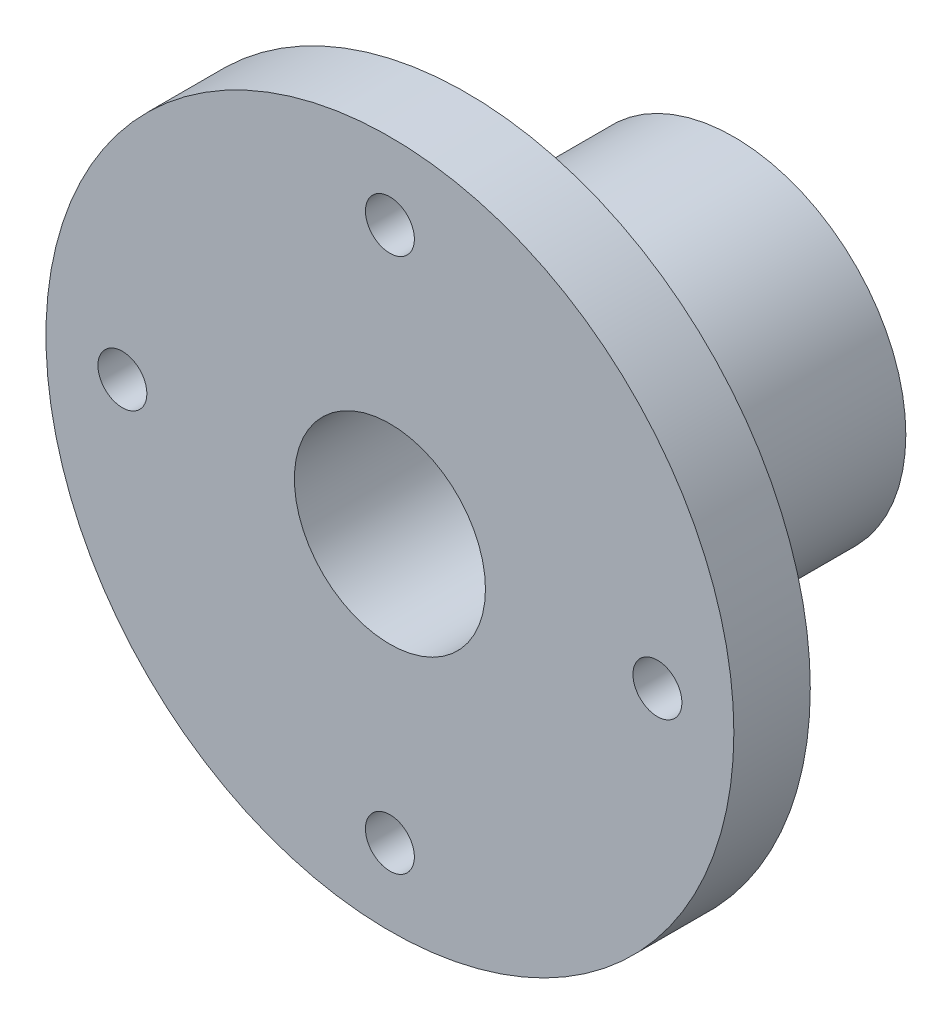
ISO-10303-21;
HEADER;
FILE_DESCRIPTION(('STEP AP214'),'2;1');
FILE_NAME('part.step','',(''),(''),'','','');
FILE_SCHEMA(('AUTOMOTIVE_DESIGN { 1 0 10303 214 1 1 1 1 }'));
ENDSEC;
DATA;
#1=APPLICATION_CONTEXT('core data for automotive mechanical design processes');
#2=APPLICATION_PROTOCOL_DEFINITION('international standard','automotive_design',2000,#1);
#3=PRODUCT_CONTEXT('',#1,'mechanical');
#4=PRODUCT('Part','Part','',(#3));
#5=PRODUCT_RELATED_PRODUCT_CATEGORY('part','',(#4));
#6=PRODUCT_DEFINITION_FORMATION('','',#4);
#7=PRODUCT_DEFINITION_CONTEXT('part definition',#1,'design');
#8=PRODUCT_DEFINITION('design','',#6,#7);
#9=PRODUCT_DEFINITION_SHAPE('','',#8);
#10=(LENGTH_UNIT() NAMED_UNIT(*) SI_UNIT(.MILLI.,.METRE.));
#11=(NAMED_UNIT(*) PLANE_ANGLE_UNIT() SI_UNIT($,.RADIAN.));
#12=(NAMED_UNIT(*) SI_UNIT($,.STERADIAN.) SOLID_ANGLE_UNIT());
#13=UNCERTAINTY_MEASURE_WITH_UNIT(LENGTH_MEASURE(1.E-05),#10,'distance_accuracy_value','');
#14=(GEOMETRIC_REPRESENTATION_CONTEXT(3) GLOBAL_UNCERTAINTY_ASSIGNED_CONTEXT((#13)) GLOBAL_UNIT_ASSIGNED_CONTEXT((#10,
#11,#12)) REPRESENTATION_CONTEXT('',''));
#15=CARTESIAN_POINT('',(0.,0.,0.));
#16=DIRECTION('',(0.,0.,1.));
#17=DIRECTION('',(1.,0.,0.));
#18=AXIS2_PLACEMENT_3D('',#15,#16,#17);
#19=CARTESIAN_POINT('',(0.,0.,-35.));
#20=DIRECTION('',(0.,0.,1.));
#21=DIRECTION('',(1.,0.,0.));
#22=AXIS2_PLACEMENT_3D('',#19,#20,#21);
#23=CYLINDRICAL_SURFACE('',#22,12.5);
#24=CARTESIAN_POINT('',(0.,0.,10.));
#25=DIRECTION('',(0.,0.,1.));
#26=DIRECTION('',(1.,0.,0.));
#27=AXIS2_PLACEMENT_3D('',#24,#25,#26);
#28=CIRCLE('',#27,12.5);
#29=CARTESIAN_POINT('',(12.5,0.,10.));
#30=VERTEX_POINT('',#29);
#31=EDGE_CURVE('E189',#30,#30,#28,.T.);
#32=ORIENTED_EDGE('',*,*,#31,.T.);
#33=EDGE_LOOP('',(#32));
#34=FACE_BOUND('',#33,.T.);
#35=CARTESIAN_POINT('',(0.,0.,-35.));
#36=DIRECTION('',(0.,0.,1.));
#37=DIRECTION('',(1.,0.,0.));
#38=AXIS2_PLACEMENT_3D('',#35,#36,#37);
#39=CIRCLE('',#38,12.5);
#40=CARTESIAN_POINT('',(12.5,0.,-35.));
#41=VERTEX_POINT('',#40);
#42=EDGE_CURVE('E340',#41,#41,#39,.T.);
#43=ORIENTED_EDGE('',*,*,#42,.F.);
#44=EDGE_LOOP('',(#43));
#45=FACE_BOUND('',#44,.T.);
#46=DIRECTION('',(0.,0.,1.));
#47=VECTOR('',#46,1.);
#48=CARTESIAN_POINT('',(4.,11.842719282327,-35.));
#49=LINE('',#48,#47);
#50=CARTESIAN_POINT('',(4.,11.842719282327,-28.));
#51=VERTEX_POINT('',#50);
#52=CARTESIAN_POINT('',(4.,11.842719282327,-6.));
#53=VERTEX_POINT('',#52);
#54=EDGE_CURVE('E203',#51,#53,#49,.T.);
#55=ORIENTED_EDGE('',*,*,#54,.F.);
#56=CARTESIAN_POINT('',(-4.,11.842719282327,-28.));
#57=CARTESIAN_POINT('',(-4.,11.842719282327,-29.0643809044189));
#58=CARTESIAN_POINT('',(-3.56109934168616,12.005579467177,-30.0956155873037));
#59=CARTESIAN_POINT('',(-2.09629276634931,12.3458869062458,-31.5607007525007));
#60=CARTESIAN_POINT('',(-1.05534649825378,12.4996525941874,-31.9989143563186));
#61=CARTESIAN_POINT('',(1.04710072965423,12.5003460459585,-32.0010813941365));
#62=CARTESIAN_POINT('',(2.09036421520958,12.3471977711214,-31.5660875845717));
#63=CARTESIAN_POINT('',(3.56494631593845,12.0047521055576,-30.0923099621094));
#64=CARTESIAN_POINT('',(4.,11.842719282327,-29.0644753189381));
#65=CARTESIAN_POINT('',(4.,11.842719282327,-28.));
#66=B_SPLINE_CURVE_WITH_KNOTS('',3,(#56,#57,#58,#59,#60,#61,#62,#63,#64,#65),.UNSPECIFIED.,.F.,
.F.,(4,2,2,2,4),(0.,0.25,0.5,0.75,1.),.UNSPECIFIED.);
#67=CARTESIAN_POINT('',(-4.,11.842719282327,-28.));
#68=VERTEX_POINT('',#67);
#69=EDGE_CURVE('E119',#68,#51,#66,.T.);
#70=ORIENTED_EDGE('',*,*,#69,.F.);
#71=DIRECTION('',(0.,0.,1.));
#72=VECTOR('',#71,1.);
#73=CARTESIAN_POINT('',(-4.,11.842719282327,-35.));
#74=LINE('',#73,#72);
#75=CARTESIAN_POINT('',(-4.,11.842719282327,-6.));
#76=VERTEX_POINT('',#75);
#77=EDGE_CURVE('E114',#68,#76,#74,.T.);
#78=ORIENTED_EDGE('',*,*,#77,.T.);
#79=CARTESIAN_POINT('',(4.,11.842719282327,-6.));
#80=CARTESIAN_POINT('',(4.,11.842719282327,-4.93561909558115));
#81=CARTESIAN_POINT('',(3.56109934168617,12.005579467177,-3.90438441269636));
#82=CARTESIAN_POINT('',(2.09629276634932,12.3458869062458,-2.43929924749928));
#83=CARTESIAN_POINT('',(1.05534649825378,12.4996525941874,-2.00108564368137));
#84=CARTESIAN_POINT('',(-1.04710072965422,12.5003460459585,-1.99891860586349));
#85=CARTESIAN_POINT('',(-2.09036421520958,12.3471977711214,-2.4339124154283));
#86=CARTESIAN_POINT('',(-3.56494631593845,12.0047521055576,-3.90769003789065));
#87=CARTESIAN_POINT('',(-4.,11.842719282327,-4.93552468106193));
#88=CARTESIAN_POINT('',(-4.,11.842719282327,-6.));
#89=B_SPLINE_CURVE_WITH_KNOTS('',3,(#79,#80,#81,#82,#83,#84,#85,#86,#87,#88),.UNSPECIFIED.,.F.,
.F.,(4,2,2,2,4),(0.,0.25,0.5,0.75,1.),.UNSPECIFIED.);
#90=EDGE_CURVE('E63',#53,#76,#89,.T.);
#91=ORIENTED_EDGE('',*,*,#90,.F.);
#92=EDGE_LOOP('',(#55,#70,#78,#91));
#93=FACE_BOUND('',#92,.T.);
#94=ADVANCED_FACE('F43',(#34,#45,#93),#23,.F.);
#95=CARTESIAN_POINT('',(0.,0.,-35.));
#96=DIRECTION('',(0.,0.,1.));
#97=DIRECTION('',(1.,0.,0.));
#98=AXIS2_PLACEMENT_3D('',#95,#96,#97);
#99=CYLINDRICAL_SURFACE('',#98,22.5);
#100=CARTESIAN_POINT('',(0.,0.,-35.));
#101=DIRECTION('',(0.,0.,1.));
#102=DIRECTION('',(1.,0.,0.));
#103=AXIS2_PLACEMENT_3D('',#100,#101,#102);
#104=CIRCLE('',#103,22.5);
#105=CARTESIAN_POINT('',(22.5,0.,-35.));
#106=VERTEX_POINT('',#105);
#107=EDGE_CURVE('E11',#106,#106,#104,.T.);
#108=ORIENTED_EDGE('',*,*,#107,.T.);
#109=EDGE_LOOP('',(#108));
#110=FACE_BOUND('',#109,.T.);
#111=CARTESIAN_POINT('',(0.,0.,0.));
#112=DIRECTION('',(0.,0.,1.));
#113=DIRECTION('',(1.,0.,0.));
#114=AXIS2_PLACEMENT_3D('',#111,#112,#113);
#115=CIRCLE('',#114,22.5);
#116=CARTESIAN_POINT('',(22.5,0.,0.));
#117=VERTEX_POINT('',#116);
#118=EDGE_CURVE('E55',#117,#117,#115,.T.);
#119=ORIENTED_EDGE('',*,*,#118,.F.);
#120=EDGE_LOOP('',(#119));
#121=FACE_BOUND('',#120,.T.);
#122=ADVANCED_FACE('F45',(#110,#121),#99,.T.);
#123=CARTESIAN_POINT('',(0.,0.,-35.));
#124=DIRECTION('',(0.,0.,1.));
#125=DIRECTION('',(1.,0.,0.));
#126=AXIS2_PLACEMENT_3D('',#123,#124,#125);
#127=PLANE('',#126);
#128=ORIENTED_EDGE('',*,*,#42,.T.);
#129=EDGE_LOOP('',(#128));
#130=FACE_BOUND('',#129,.T.);
#131=ORIENTED_EDGE('',*,*,#107,.F.);
#132=EDGE_LOOP('',(#131));
#133=FACE_BOUND('',#132,.T.);
#134=ADVANCED_FACE('F359',(#130,#133),#127,.F.);
#135=CARTESIAN_POINT('',(0.,0.,10.));
#136=DIRECTION('',(0.,0.,1.));
#137=DIRECTION('',(1.,0.,0.));
#138=AXIS2_PLACEMENT_3D('',#135,#136,#137);
#139=PLANE('',#138);
#140=CARTESIAN_POINT('',(0.,35.,10.));
#141=DIRECTION('',(0.,0.,-1.));
#142=DIRECTION('',(-1.,0.,0.));
#143=AXIS2_PLACEMENT_3D('',#140,#141,#142);
#144=CIRCLE('',#143,3.2);
#145=CARTESIAN_POINT('',(-3.2,35.,10.));
#146=VERTEX_POINT('',#145);
#147=EDGE_CURVE('E291',#146,#146,#144,.T.);
#148=ORIENTED_EDGE('',*,*,#147,.T.);
#149=EDGE_LOOP('',(#148));
#150=FACE_BOUND('',#149,.T.);
#151=CARTESIAN_POINT('',(-35.,-1.2220184685951E-13,10.));
#152=DIRECTION('',(0.,0.,-1.));
#153=DIRECTION('',(-1.,0.,0.));
#154=AXIS2_PLACEMENT_3D('',#151,#152,#153);
#155=CIRCLE('',#154,3.2);
#156=CARTESIAN_POINT('',(-38.2,-1.2220184685951E-13,10.));
#157=VERTEX_POINT('',#156);
#158=EDGE_CURVE('E271',#157,#157,#155,.T.);
#159=ORIENTED_EDGE('',*,*,#158,.T.);
#160=EDGE_LOOP('',(#159));
#161=FACE_BOUND('',#160,.T.);
#162=CARTESIAN_POINT('',(2.44403693719019E-13,-35.,10.));
#163=DIRECTION('',(0.,0.,-1.));
#164=DIRECTION('',(-1.,0.,0.));
#165=AXIS2_PLACEMENT_3D('',#162,#163,#164);
#166=CIRCLE('',#165,3.2);
#167=CARTESIAN_POINT('',(-3.19999999999975,-35.,10.));
#168=VERTEX_POINT('',#167);
#169=EDGE_CURVE('E251',#168,#168,#166,.T.);
#170=ORIENTED_EDGE('',*,*,#169,.T.);
#171=EDGE_LOOP('',(#170));
#172=FACE_BOUND('',#171,.T.);
#173=CARTESIAN_POINT('',(35.,3.66605540578529E-13,10.));
#174=DIRECTION('',(0.,0.,-1.));
#175=DIRECTION('',(-1.,0.,0.));
#176=AXIS2_PLACEMENT_3D('',#173,#174,#175);
#177=CIRCLE('',#176,3.2);
#178=CARTESIAN_POINT('',(31.8,3.66605540578529E-13,10.));
#179=VERTEX_POINT('',#178);
#180=EDGE_CURVE('E130',#179,#179,#177,.T.);
#181=ORIENTED_EDGE('',*,*,#180,.T.);
#182=EDGE_LOOP('',(#181));
#183=FACE_BOUND('',#182,.T.);
#184=CARTESIAN_POINT('',(0.,0.,10.));
#185=DIRECTION('',(0.,0.,1.));
#186=DIRECTION('',(1.,0.,0.));
#187=AXIS2_PLACEMENT_3D('',#184,#185,#186);
#188=CIRCLE('',#187,45.);
#189=CARTESIAN_POINT('',(45.,0.,10.));
#190=VERTEX_POINT('',#189);
#191=EDGE_CURVE('E335',#190,#190,#188,.T.);
#192=ORIENTED_EDGE('',*,*,#191,.T.);
#193=EDGE_LOOP('',(#192));
#194=FACE_BOUND('',#193,.T.);
#195=ORIENTED_EDGE('',*,*,#31,.F.);
#196=EDGE_LOOP('',(#195));
#197=FACE_BOUND('',#196,.T.);
#198=ADVANCED_FACE('F319',(#150,#161,#172,#183,#194,#197),#139,.T.);
#199=CARTESIAN_POINT('',(0.,0.,0.));
#200=DIRECTION('',(0.,0.,1.));
#201=DIRECTION('',(1.,0.,0.));
#202=AXIS2_PLACEMENT_3D('',#199,#200,#201);
#203=PLANE('',#202);
#204=CARTESIAN_POINT('',(0.,35.,0.));
#205=DIRECTION('',(0.,0.,-1.));
#206=DIRECTION('',(-1.,0.,0.));
#207=AXIS2_PLACEMENT_3D('',#204,#205,#206);
#208=CIRCLE('',#207,7.3);
#209=CARTESIAN_POINT('',(-7.3,35.,0.));
#210=VERTEX_POINT('',#209);
#211=EDGE_CURVE('E307',#210,#210,#208,.T.);
#212=ORIENTED_EDGE('',*,*,#211,.F.);
#213=EDGE_LOOP('',(#212));
#214=FACE_BOUND('',#213,.T.);
#215=CARTESIAN_POINT('',(-35.,-1.2220184685951E-13,0.));
#216=DIRECTION('',(0.,0.,-1.));
#217=DIRECTION('',(-1.,0.,0.));
#218=AXIS2_PLACEMENT_3D('',#215,#216,#217);
#219=CIRCLE('',#218,7.3);
#220=CARTESIAN_POINT('',(-42.3,-1.2220184685951E-13,0.));
#221=VERTEX_POINT('',#220);
#222=EDGE_CURVE('E287',#221,#221,#219,.T.);
#223=ORIENTED_EDGE('',*,*,#222,.F.);
#224=EDGE_LOOP('',(#223));
#225=FACE_BOUND('',#224,.T.);
#226=CARTESIAN_POINT('',(2.44403693719019E-13,-35.,0.));
#227=DIRECTION('',(0.,0.,-1.));
#228=DIRECTION('',(-1.,0.,0.));
#229=AXIS2_PLACEMENT_3D('',#226,#227,#228);
#230=CIRCLE('',#229,7.3);
#231=CARTESIAN_POINT('',(-7.29999999999976,-35.,0.));
#232=VERTEX_POINT('',#231);
#233=EDGE_CURVE('E267',#232,#232,#230,.T.);
#234=ORIENTED_EDGE('',*,*,#233,.F.);
#235=EDGE_LOOP('',(#234));
#236=FACE_BOUND('',#235,.T.);
#237=CARTESIAN_POINT('',(35.,3.66605540578529E-13,0.));
#238=DIRECTION('',(0.,0.,-1.));
#239=DIRECTION('',(-1.,0.,0.));
#240=AXIS2_PLACEMENT_3D('',#237,#238,#239);
#241=CIRCLE('',#240,7.3);
#242=CARTESIAN_POINT('',(27.7,3.66605540578529E-13,0.));
#243=VERTEX_POINT('',#242);
#244=EDGE_CURVE('E247',#243,#243,#241,.T.);
#245=ORIENTED_EDGE('',*,*,#244,.F.);
#246=EDGE_LOOP('',(#245));
#247=FACE_BOUND('',#246,.T.);
#248=ORIENTED_EDGE('',*,*,#118,.T.);
#249=EDGE_LOOP('',(#248));
#250=FACE_BOUND('',#249,.T.);
#251=CARTESIAN_POINT('',(0.,0.,0.));
#252=DIRECTION('',(0.,0.,1.));
#253=DIRECTION('',(1.,0.,0.));
#254=AXIS2_PLACEMENT_3D('',#251,#252,#253);
#255=CIRCLE('',#254,45.);
#256=CARTESIAN_POINT('',(45.,0.,0.));
#257=VERTEX_POINT('',#256);
#258=EDGE_CURVE('E332',#257,#257,#255,.T.);
#259=ORIENTED_EDGE('',*,*,#258,.F.);
#260=EDGE_LOOP('',(#259));
#261=FACE_BOUND('',#260,.T.);
#262=ADVANCED_FACE('F315',(#214,#225,#236,#247,#250,#261),#203,.F.);
#263=CARTESIAN_POINT('',(0.,0.,10.));
#264=DIRECTION('',(0.,0.,-1.));
#265=DIRECTION('',(-1.,0.,0.));
#266=AXIS2_PLACEMENT_3D('',#263,#264,#265);
#267=CYLINDRICAL_SURFACE('',#266,45.);
#268=ORIENTED_EDGE('',*,*,#191,.F.);
#269=EDGE_LOOP('',(#268));
#270=FACE_BOUND('',#269,.T.);
#271=ORIENTED_EDGE('',*,*,#258,.T.);
#272=EDGE_LOOP('',(#271));
#273=FACE_BOUND('',#272,.T.);
#274=ADVANCED_FACE('F318',(#270,#273),#267,.T.);
#275=CARTESIAN_POINT('',(0.,4.,-35.));
#276=DIRECTION('',(0.,0.,1.));
#277=DIRECTION('',(1.,0.,0.));
#278=AXIS2_PLACEMENT_3D('',#275,#276,#277);
#279=CYLINDRICAL_SURFACE('',#278,12.5);
#280=DIRECTION('',(0.,0.,1.));
#281=VECTOR('',#280,1.);
#282=CARTESIAN_POINT('',(4.,15.842719282327,-35.));
#283=LINE('',#282,#281);
#284=CARTESIAN_POINT('',(4.,15.842719282327,-28.));
#285=VERTEX_POINT('',#284);
#286=CARTESIAN_POINT('',(4.,15.842719282327,-6.));
#287=VERTEX_POINT('',#286);
#288=EDGE_CURVE('E101',#285,#287,#283,.T.);
#289=ORIENTED_EDGE('',*,*,#288,.T.);
#290=CARTESIAN_POINT('',(-4.,15.842719282327,-6.));
#291=CARTESIAN_POINT('',(-4.,15.842719282327,-4.93552468106193));
#292=CARTESIAN_POINT('',(-3.56494631593845,16.0047521055576,-3.90769003789065));
#293=CARTESIAN_POINT('',(-2.09036421520958,16.3471977711214,-2.4339124154283));
#294=CARTESIAN_POINT('',(-1.04710072965422,16.5003460459585,-1.99891860586349));
#295=CARTESIAN_POINT('',(1.05534649825378,16.4996525941874,-2.00108564368137));
#296=CARTESIAN_POINT('',(2.09629276634932,16.3458869062457,-2.43929924749928));
#297=CARTESIAN_POINT('',(3.56109934168617,16.005579467177,-3.90438441269636));
#298=CARTESIAN_POINT('',(4.,15.842719282327,-4.93561909558115));
#299=CARTESIAN_POINT('',(4.,15.842719282327,-6.));
#300=B_SPLINE_CURVE_WITH_KNOTS('',3,(#290,#291,#292,#293,#294,#295,#296,#297,#298,#299),
.UNSPECIFIED.,.F.,.F.,(4,2,2,2,4),(0.,0.25,0.5,0.75,1.),.UNSPECIFIED.);
#301=CARTESIAN_POINT('',(-4.,15.842719282327,-6.));
#302=VERTEX_POINT('',#301);
#303=EDGE_CURVE('E98',#287,#302,#300,.F.);
#304=ORIENTED_EDGE('',*,*,#303,.T.);
#305=DIRECTION('',(0.,0.,1.));
#306=VECTOR('',#305,1.);
#307=CARTESIAN_POINT('',(-4.,15.842719282327,-35.));
#308=LINE('',#307,#306);
#309=CARTESIAN_POINT('',(-4.,15.842719282327,-28.));
#310=VERTEX_POINT('',#309);
#311=EDGE_CURVE('E94',#310,#302,#308,.T.);
#312=ORIENTED_EDGE('',*,*,#311,.F.);
#313=CARTESIAN_POINT('',(4.,15.842719282327,-28.));
#314=CARTESIAN_POINT('',(4.,15.842719282327,-29.0644753189381));
#315=CARTESIAN_POINT('',(3.56494631593845,16.0047521055576,-30.0923099621094));
#316=CARTESIAN_POINT('',(2.09036421520958,16.3471977711214,-31.5660875845717));
#317=CARTESIAN_POINT('',(1.04710072965423,16.5003460459585,-32.0010813941365));
#318=CARTESIAN_POINT('',(-1.05534649825378,16.4996525941874,-31.9989143563186));
#319=CARTESIAN_POINT('',(-2.09629276634931,16.3458869062458,-31.5607007525007));
#320=CARTESIAN_POINT('',(-3.56109934168616,16.005579467177,-30.0956155873037));
#321=CARTESIAN_POINT('',(-4.,15.842719282327,-29.0643809044189));
#322=CARTESIAN_POINT('',(-4.,15.842719282327,-28.));
#323=B_SPLINE_CURVE_WITH_KNOTS('',3,(#313,#314,#315,#316,#317,#318,#319,#320,#321,#322),
.UNSPECIFIED.,.F.,.F.,(4,2,2,2,4),(0.,0.25,0.5,0.75,1.),.UNSPECIFIED.);
#324=EDGE_CURVE('E90',#310,#285,#323,.F.);
#325=ORIENTED_EDGE('',*,*,#324,.T.);
#326=EDGE_LOOP('',(#289,#304,#312,#325));
#327=FACE_BOUND('',#326,.T.);
#328=ADVANCED_FACE('F100',(#327),#279,.F.);
#329=CARTESIAN_POINT('',(4.,11.842719282327,-35.));
#330=DIRECTION('',(-1.,0.,0.));
#331=DIRECTION('',(0.,0.,1.));
#332=AXIS2_PLACEMENT_3D('',#329,#330,#331);
#333=PLANE('',#332);
#334=ORIENTED_EDGE('',*,*,#288,.F.);
#335=DIRECTION('',(0.,1.,0.));
#336=VECTOR('',#335,1.);
#337=CARTESIAN_POINT('',(4.,11.842719282327,-28.));
#338=LINE('',#337,#336);
#339=EDGE_CURVE('E73',#51,#285,#338,.T.);
#340=ORIENTED_EDGE('',*,*,#339,.F.);
#341=ORIENTED_EDGE('',*,*,#54,.T.);
#342=DIRECTION('',(0.,1.,0.));
#343=VECTOR('',#342,1.);
#344=CARTESIAN_POINT('',(4.,11.842719282327,-6.));
#345=LINE('',#344,#343);
#346=EDGE_CURVE('E206',#53,#287,#345,.T.);
#347=ORIENTED_EDGE('',*,*,#346,.T.);
#348=EDGE_LOOP('',(#334,#340,#341,#347));
#349=FACE_BOUND('',#348,.T.);
#350=ADVANCED_FACE('F168',(#349),#333,.T.);
#351=CARTESIAN_POINT('',(-4.,11.842719282327,-28.));
#352=CARTESIAN_POINT('',(-4.,11.842719282327,-29.0643809044189));
#353=CARTESIAN_POINT('',(-3.56109934168616,12.005579467177,-30.0956155873037));
#354=CARTESIAN_POINT('',(-2.09629276634931,12.3458869062458,-31.5607007525007));
#355=CARTESIAN_POINT('',(-1.05534649825378,12.4996525941874,-31.9989143563186));
#356=CARTESIAN_POINT('',(1.04710072965423,12.5003460459585,-32.0010813941365));
#357=CARTESIAN_POINT('',(2.09036421520958,12.3471977711214,-31.5660875845717));
#358=CARTESIAN_POINT('',(3.56494631593845,12.0047521055576,-30.0923099621094));
#359=CARTESIAN_POINT('',(4.,11.842719282327,-29.0644753189381));
#360=CARTESIAN_POINT('',(4.,11.842719282327,-28.));
#361=B_SPLINE_CURVE_WITH_KNOTS('',3,(#351,#352,#353,#354,#355,#356,#357,#358,#359,#360),
.UNSPECIFIED.,.F.,.F.,(4,2,2,2,4),(0.,0.25,0.5,0.75,1.),.UNSPECIFIED.);
#362=DIRECTION('',(0.,1.,0.));
#363=VECTOR('',#362,1.);
#364=SURFACE_OF_LINEAR_EXTRUSION('',#361,#363);
#365=ORIENTED_EDGE('',*,*,#324,.F.);
#366=DIRECTION('',(0.,1.,0.));
#367=VECTOR('',#366,1.);
#368=CARTESIAN_POINT('',(-4.,11.842719282327,-28.));
#369=LINE('',#368,#367);
#370=EDGE_CURVE('E117',#68,#310,#369,.T.);
#371=ORIENTED_EDGE('',*,*,#370,.F.);
#372=ORIENTED_EDGE('',*,*,#69,.T.);
#373=ORIENTED_EDGE('',*,*,#339,.T.);
#374=EDGE_LOOP('',(#365,#371,#372,#373));
#375=FACE_BOUND('',#374,.T.);
#376=ADVANCED_FACE('F144',(#375),#364,.T.);
#377=CARTESIAN_POINT('',(4.,11.842719282327,-6.));
#378=CARTESIAN_POINT('',(4.,11.842719282327,-4.93561909558115));
#379=CARTESIAN_POINT('',(3.56109934168617,12.005579467177,-3.90438441269636));
#380=CARTESIAN_POINT('',(2.09629276634932,12.3458869062458,-2.43929924749928));
#381=CARTESIAN_POINT('',(1.05534649825378,12.4996525941874,-2.00108564368137));
#382=CARTESIAN_POINT('',(-1.04710072965422,12.5003460459585,-1.99891860586349));
#383=CARTESIAN_POINT('',(-2.09036421520958,12.3471977711214,-2.4339124154283));
#384=CARTESIAN_POINT('',(-3.56494631593845,12.0047521055576,-3.90769003789065));
#385=CARTESIAN_POINT('',(-4.,11.842719282327,-4.93552468106193));
#386=CARTESIAN_POINT('',(-4.,11.842719282327,-6.));
#387=B_SPLINE_CURVE_WITH_KNOTS('',3,(#377,#378,#379,#380,#381,#382,#383,#384,#385,#386),
.UNSPECIFIED.,.F.,.F.,(4,2,2,2,4),(0.,0.25,0.5,0.75,1.),.UNSPECIFIED.);
#388=DIRECTION('',(0.,1.,0.));
#389=VECTOR('',#388,1.);
#390=SURFACE_OF_LINEAR_EXTRUSION('',#387,#389);
#391=ORIENTED_EDGE('',*,*,#303,.F.);
#392=ORIENTED_EDGE('',*,*,#346,.F.);
#393=ORIENTED_EDGE('',*,*,#90,.T.);
#394=DIRECTION('',(0.,1.,0.));
#395=VECTOR('',#394,1.);
#396=CARTESIAN_POINT('',(-4.,11.842719282327,-6.));
#397=LINE('',#396,#395);
#398=EDGE_CURVE('E105',#76,#302,#397,.T.);
#399=ORIENTED_EDGE('',*,*,#398,.T.);
#400=EDGE_LOOP('',(#391,#392,#393,#399));
#401=FACE_BOUND('',#400,.T.);
#402=ADVANCED_FACE('F109',(#401),#390,.T.);
#403=CARTESIAN_POINT('',(-4.,11.842719282327,-35.));
#404=DIRECTION('',(-1.,0.,0.));
#405=DIRECTION('',(0.,0.,1.));
#406=AXIS2_PLACEMENT_3D('',#403,#404,#405);
#407=PLANE('',#406);
#408=ORIENTED_EDGE('',*,*,#311,.T.);
#409=ORIENTED_EDGE('',*,*,#398,.F.);
#410=ORIENTED_EDGE('',*,*,#77,.F.);
#411=ORIENTED_EDGE('',*,*,#370,.T.);
#412=EDGE_LOOP('',(#408,#409,#410,#411));
#413=FACE_BOUND('',#412,.T.);
#414=ADVANCED_FACE('F116',(#413),#407,.F.);
#415=CARTESIAN_POINT('',(35.,3.66605540578529E-13,0.));
#416=DIRECTION('',(0.,0.,-1.));
#417=DIRECTION('',(-1.,0.,0.));
#418=AXIS2_PLACEMENT_3D('',#415,#416,#417);
#419=CYLINDRICAL_SURFACE('',#418,3.2);
#420=ORIENTED_EDGE('',*,*,#180,.F.);
#421=EDGE_LOOP('',(#420));
#422=FACE_BOUND('',#421,.T.);
#423=CARTESIAN_POINT('',(35.,3.66605540578529E-13,4.38));
#424=DIRECTION('',(0.,0.,-1.));
#425=DIRECTION('',(-1.,0.,0.));
#426=AXIS2_PLACEMENT_3D('',#423,#424,#425);
#427=CIRCLE('',#426,3.2);
#428=CARTESIAN_POINT('',(31.8,3.66605540578529E-13,4.38));
#429=VERTEX_POINT('',#428);
#430=EDGE_CURVE('E237',#429,#429,#427,.T.);
#431=ORIENTED_EDGE('',*,*,#430,.T.);
#432=EDGE_LOOP('',(#431));
#433=FACE_BOUND('',#432,.T.);
#434=ADVANCED_FACE('F395',(#422,#433),#419,.F.);
#435=CARTESIAN_POINT('',(42.275,3.66605540578529E-13,4.38));
#436=DIRECTION('',(0.,0.,1.));
#437=DIRECTION('',(1.,0.,0.));
#438=AXIS2_PLACEMENT_3D('',#435,#436,#437);
#439=PLANE('',#438);
#440=ORIENTED_EDGE('',*,*,#430,.F.);
#441=EDGE_LOOP('',(#440));
#442=FACE_BOUND('',#441,.T.);
#443=CARTESIAN_POINT('',(35.,3.66605540578529E-13,4.38));
#444=DIRECTION('',(0.,0.,-1.));
#445=DIRECTION('',(-1.,0.,0.));
#446=AXIS2_PLACEMENT_3D('',#443,#444,#445);
#447=CIRCLE('',#446,7.275);
#448=CARTESIAN_POINT('',(27.725,3.66605540578529E-13,4.38));
#449=VERTEX_POINT('',#448);
#450=EDGE_CURVE('E240',#449,#449,#447,.T.);
#451=ORIENTED_EDGE('',*,*,#450,.T.);
#452=EDGE_LOOP('',(#451));
#453=FACE_BOUND('',#452,.T.);
#454=ADVANCED_FACE('F448',(#442,#453),#439,.F.);
#455=CARTESIAN_POINT('',(35.,3.66605540578529E-13,0.));
#456=DIRECTION('',(0.,0.,-1.));
#457=DIRECTION('',(-1.,0.,0.));
#458=AXIS2_PLACEMENT_3D('',#455,#456,#457);
#459=CYLINDRICAL_SURFACE('',#458,7.275);
#460=ORIENTED_EDGE('',*,*,#450,.F.);
#461=EDGE_LOOP('',(#460));
#462=FACE_BOUND('',#461,.T.);
#463=CARTESIAN_POINT('',(35.,3.66605540578529E-13,0.0250000000000012));
#464=DIRECTION('',(0.,0.,-1.));
#465=DIRECTION('',(-1.,0.,0.));
#466=AXIS2_PLACEMENT_3D('',#463,#464,#465);
#467=CIRCLE('',#466,7.275);
#468=CARTESIAN_POINT('',(27.725,3.66605540578529E-13,0.0250000000000012));
#469=VERTEX_POINT('',#468);
#470=EDGE_CURVE('E243',#469,#469,#467,.T.);
#471=ORIENTED_EDGE('',*,*,#470,.T.);
#472=EDGE_LOOP('',(#471));
#473=FACE_BOUND('',#472,.T.);
#474=ADVANCED_FACE('F458',(#462,#473),#459,.F.);
#475=CARTESIAN_POINT('',(35.,3.66605540578529E-13,0.));
#476=DIRECTION('',(0.,0.,-1.));
#477=DIRECTION('',(-1.,0.,0.));
#478=AXIS2_PLACEMENT_3D('',#475,#476,#477);
#479=CONICAL_SURFACE('',#478,7.3,0.785398163397507);
#480=ORIENTED_EDGE('',*,*,#470,.F.);
#481=EDGE_LOOP('',(#480));
#482=FACE_BOUND('',#481,.T.);
#483=ORIENTED_EDGE('',*,*,#244,.T.);
#484=EDGE_LOOP('',(#483));
#485=FACE_BOUND('',#484,.T.);
#486=ADVANCED_FACE('F469',(#482,#485),#479,.F.);
#487=CARTESIAN_POINT('',(2.44403693719019E-13,-35.,0.));
#488=DIRECTION('',(0.,0.,-1.));
#489=DIRECTION('',(-1.,0.,0.));
#490=AXIS2_PLACEMENT_3D('',#487,#488,#489);
#491=CYLINDRICAL_SURFACE('',#490,3.2);
#492=ORIENTED_EDGE('',*,*,#169,.F.);
#493=EDGE_LOOP('',(#492));
#494=FACE_BOUND('',#493,.T.);
#495=CARTESIAN_POINT('',(2.44403693719019E-13,-35.,4.38));
#496=DIRECTION('',(0.,0.,-1.));
#497=DIRECTION('',(-1.,0.,0.));
#498=AXIS2_PLACEMENT_3D('',#495,#496,#497);
#499=CIRCLE('',#498,3.2);
#500=CARTESIAN_POINT('',(-3.19999999999976,-35.,4.38));
#501=VERTEX_POINT('',#500);
#502=EDGE_CURVE('E255',#501,#501,#499,.T.);
#503=ORIENTED_EDGE('',*,*,#502,.T.);
#504=EDGE_LOOP('',(#503));
#505=FACE_BOUND('',#504,.T.);
#506=ADVANCED_FACE('F480',(#494,#505),#491,.F.);
#507=CARTESIAN_POINT('',(7.27500000000024,-35.,4.38));
#508=DIRECTION('',(0.,0.,1.));
#509=DIRECTION('',(1.,0.,0.));
#510=AXIS2_PLACEMENT_3D('',#507,#508,#509);
#511=PLANE('',#510);
#512=ORIENTED_EDGE('',*,*,#502,.F.);
#513=EDGE_LOOP('',(#512));
#514=FACE_BOUND('',#513,.T.);
#515=CARTESIAN_POINT('',(2.44403693719019E-13,-35.,4.38));
#516=DIRECTION('',(0.,0.,-1.));
#517=DIRECTION('',(-1.,0.,0.));
#518=AXIS2_PLACEMENT_3D('',#515,#516,#517);
#519=CIRCLE('',#518,7.275);
#520=CARTESIAN_POINT('',(-7.27499999999976,-35.,4.38));
#521=VERTEX_POINT('',#520);
#522=EDGE_CURVE('E259',#521,#521,#519,.T.);
#523=ORIENTED_EDGE('',*,*,#522,.T.);
#524=EDGE_LOOP('',(#523));
#525=FACE_BOUND('',#524,.T.);
#526=ADVANCED_FACE('F491',(#514,#525),#511,.F.);
#527=CARTESIAN_POINT('',(2.44403693719019E-13,-35.,0.));
#528=DIRECTION('',(0.,0.,-1.));
#529=DIRECTION('',(-1.,0.,0.));
#530=AXIS2_PLACEMENT_3D('',#527,#528,#529);
#531=CYLINDRICAL_SURFACE('',#530,7.275);
#532=ORIENTED_EDGE('',*,*,#522,.F.);
#533=EDGE_LOOP('',(#532));
#534=FACE_BOUND('',#533,.T.);
#535=CARTESIAN_POINT('',(2.44403693719019E-13,-35.,0.0250000000000012));
#536=DIRECTION('',(0.,0.,-1.));
#537=DIRECTION('',(-1.,0.,0.));
#538=AXIS2_PLACEMENT_3D('',#535,#536,#537);
#539=CIRCLE('',#538,7.275);
#540=CARTESIAN_POINT('',(-7.27499999999975,-35.,0.0250000000000012));
#541=VERTEX_POINT('',#540);
#542=EDGE_CURVE('E263',#541,#541,#539,.T.);
#543=ORIENTED_EDGE('',*,*,#542,.T.);
#544=EDGE_LOOP('',(#543));
#545=FACE_BOUND('',#544,.T.);
#546=ADVANCED_FACE('F502',(#534,#545),#531,.F.);
#547=CARTESIAN_POINT('',(2.44403693719019E-13,-35.,0.));
#548=DIRECTION('',(0.,0.,-1.));
#549=DIRECTION('',(-1.,0.,0.));
#550=AXIS2_PLACEMENT_3D('',#547,#548,#549);
#551=CONICAL_SURFACE('',#550,7.3,0.785398163397455);
#552=ORIENTED_EDGE('',*,*,#542,.F.);
#553=EDGE_LOOP('',(#552));
#554=FACE_BOUND('',#553,.T.);
#555=ORIENTED_EDGE('',*,*,#233,.T.);
#556=EDGE_LOOP('',(#555));
#557=FACE_BOUND('',#556,.T.);
#558=ADVANCED_FACE('F513',(#554,#557),#551,.F.);
#559=CARTESIAN_POINT('',(-35.,-1.2220184685951E-13,0.));
#560=DIRECTION('',(0.,0.,-1.));
#561=DIRECTION('',(-1.,0.,0.));
#562=AXIS2_PLACEMENT_3D('',#559,#560,#561);
#563=CYLINDRICAL_SURFACE('',#562,3.2);
#564=ORIENTED_EDGE('',*,*,#158,.F.);
#565=EDGE_LOOP('',(#564));
#566=FACE_BOUND('',#565,.T.);
#567=CARTESIAN_POINT('',(-35.,-1.2220184685951E-13,4.38));
#568=DIRECTION('',(0.,0.,-1.));
#569=DIRECTION('',(-1.,0.,0.));
#570=AXIS2_PLACEMENT_3D('',#567,#568,#569);
#571=CIRCLE('',#570,3.2);
#572=CARTESIAN_POINT('',(-38.2,-1.2220184685951E-13,4.38));
#573=VERTEX_POINT('',#572);
#574=EDGE_CURVE('E275',#573,#573,#571,.T.);
#575=ORIENTED_EDGE('',*,*,#574,.T.);
#576=EDGE_LOOP('',(#575));
#577=FACE_BOUND('',#576,.T.);
#578=ADVANCED_FACE('F524',(#566,#577),#563,.F.);
#579=CARTESIAN_POINT('',(-27.725,-1.2220184685951E-13,4.38));
#580=DIRECTION('',(0.,0.,1.));
#581=DIRECTION('',(1.,0.,0.));
#582=AXIS2_PLACEMENT_3D('',#579,#580,#581);
#583=PLANE('',#582);
#584=ORIENTED_EDGE('',*,*,#574,.F.);
#585=EDGE_LOOP('',(#584));
#586=FACE_BOUND('',#585,.T.);
#587=CARTESIAN_POINT('',(-35.,-1.2220184685951E-13,4.38));
#588=DIRECTION('',(0.,0.,-1.));
#589=DIRECTION('',(-1.,0.,0.));
#590=AXIS2_PLACEMENT_3D('',#587,#588,#589);
#591=CIRCLE('',#590,7.275);
#592=CARTESIAN_POINT('',(-42.275,-1.2220184685951E-13,4.38));
#593=VERTEX_POINT('',#592);
#594=EDGE_CURVE('E279',#593,#593,#591,.T.);
#595=ORIENTED_EDGE('',*,*,#594,.T.);
#596=EDGE_LOOP('',(#595));
#597=FACE_BOUND('',#596,.T.);
#598=ADVANCED_FACE('F535',(#586,#597),#583,.F.);
#599=CARTESIAN_POINT('',(-35.,-1.2220184685951E-13,0.));
#600=DIRECTION('',(0.,0.,-1.));
#601=DIRECTION('',(-1.,0.,0.));
#602=AXIS2_PLACEMENT_3D('',#599,#600,#601);
#603=CYLINDRICAL_SURFACE('',#602,7.275);
#604=ORIENTED_EDGE('',*,*,#594,.F.);
#605=EDGE_LOOP('',(#604));
#606=FACE_BOUND('',#605,.T.);
#607=CARTESIAN_POINT('',(-35.,-1.2220184685951E-13,0.0250000000000012));
#608=DIRECTION('',(0.,0.,-1.));
#609=DIRECTION('',(-1.,0.,0.));
#610=AXIS2_PLACEMENT_3D('',#607,#608,#609);
#611=CIRCLE('',#610,7.275);
#612=CARTESIAN_POINT('',(-42.275,-1.2220184685951E-13,0.0250000000000012));
#613=VERTEX_POINT('',#612);
#614=EDGE_CURVE('E283',#613,#613,#611,.T.);
#615=ORIENTED_EDGE('',*,*,#614,.T.);
#616=EDGE_LOOP('',(#615));
#617=FACE_BOUND('',#616,.T.);
#618=ADVANCED_FACE('F546',(#606,#617),#603,.F.);
#619=CARTESIAN_POINT('',(-35.,-1.2220184685951E-13,0.));
#620=DIRECTION('',(0.,0.,-1.));
#621=DIRECTION('',(-1.,0.,0.));
#622=AXIS2_PLACEMENT_3D('',#619,#620,#621);
#623=CONICAL_SURFACE('',#622,7.3,0.785398163397507);
#624=ORIENTED_EDGE('',*,*,#614,.F.);
#625=EDGE_LOOP('',(#624));
#626=FACE_BOUND('',#625,.T.);
#627=ORIENTED_EDGE('',*,*,#222,.T.);
#628=EDGE_LOOP('',(#627));
#629=FACE_BOUND('',#628,.T.);
#630=ADVANCED_FACE('F557',(#626,#629),#623,.F.);
#631=CARTESIAN_POINT('',(0.,35.,0.));
#632=DIRECTION('',(0.,0.,-1.));
#633=DIRECTION('',(-1.,0.,0.));
#634=AXIS2_PLACEMENT_3D('',#631,#632,#633);
#635=CYLINDRICAL_SURFACE('',#634,3.2);
#636=ORIENTED_EDGE('',*,*,#147,.F.);
#637=EDGE_LOOP('',(#636));
#638=FACE_BOUND('',#637,.T.);
#639=CARTESIAN_POINT('',(0.,35.,4.38));
#640=DIRECTION('',(0.,0.,-1.));
#641=DIRECTION('',(-1.,0.,0.));
#642=AXIS2_PLACEMENT_3D('',#639,#640,#641);
#643=CIRCLE('',#642,3.2);
#644=CARTESIAN_POINT('',(-3.2,35.,4.38));
#645=VERTEX_POINT('',#644);
#646=EDGE_CURVE('E295',#645,#645,#643,.T.);
#647=ORIENTED_EDGE('',*,*,#646,.T.);
#648=EDGE_LOOP('',(#647));
#649=FACE_BOUND('',#648,.T.);
#650=ADVANCED_FACE('F568',(#638,#649),#635,.F.);
#651=CARTESIAN_POINT('',(7.275,35.,4.38));
#652=DIRECTION('',(0.,0.,1.));
#653=DIRECTION('',(1.,0.,0.));
#654=AXIS2_PLACEMENT_3D('',#651,#652,#653);
#655=PLANE('',#654);
#656=ORIENTED_EDGE('',*,*,#646,.F.);
#657=EDGE_LOOP('',(#656));
#658=FACE_BOUND('',#657,.T.);
#659=CARTESIAN_POINT('',(0.,35.,4.38));
#660=DIRECTION('',(0.,0.,-1.));
#661=DIRECTION('',(-1.,0.,0.));
#662=AXIS2_PLACEMENT_3D('',#659,#660,#661);
#663=CIRCLE('',#662,7.275);
#664=CARTESIAN_POINT('',(-7.275,35.,4.38));
#665=VERTEX_POINT('',#664);
#666=EDGE_CURVE('E299',#665,#665,#663,.T.);
#667=ORIENTED_EDGE('',*,*,#666,.T.);
#668=EDGE_LOOP('',(#667));
#669=FACE_BOUND('',#668,.T.);
#670=ADVANCED_FACE('F579',(#658,#669),#655,.F.);
#671=CARTESIAN_POINT('',(0.,35.,0.));
#672=DIRECTION('',(0.,0.,-1.));
#673=DIRECTION('',(-1.,0.,0.));
#674=AXIS2_PLACEMENT_3D('',#671,#672,#673);
#675=CYLINDRICAL_SURFACE('',#674,7.275);
#676=ORIENTED_EDGE('',*,*,#666,.F.);
#677=EDGE_LOOP('',(#676));
#678=FACE_BOUND('',#677,.T.);
#679=CARTESIAN_POINT('',(0.,35.,0.0250000000000012));
#680=DIRECTION('',(0.,0.,-1.));
#681=DIRECTION('',(-1.,0.,0.));
#682=AXIS2_PLACEMENT_3D('',#679,#680,#681);
#683=CIRCLE('',#682,7.275);
#684=CARTESIAN_POINT('',(-7.275,35.,0.0250000000000012));
#685=VERTEX_POINT('',#684);
#686=EDGE_CURVE('E303',#685,#685,#683,.T.);
#687=ORIENTED_EDGE('',*,*,#686,.T.);
#688=EDGE_LOOP('',(#687));
#689=FACE_BOUND('',#688,.T.);
#690=ADVANCED_FACE('F590',(#678,#689),#675,.F.);
#691=CARTESIAN_POINT('',(0.,35.,0.));
#692=DIRECTION('',(0.,0.,-1.));
#693=DIRECTION('',(-1.,0.,0.));
#694=AXIS2_PLACEMENT_3D('',#691,#692,#693);
#695=CONICAL_SURFACE('',#694,7.3,0.785398163397455);
#696=ORIENTED_EDGE('',*,*,#686,.F.);
#697=EDGE_LOOP('',(#696));
#698=FACE_BOUND('',#697,.T.);
#699=ORIENTED_EDGE('',*,*,#211,.T.);
#700=EDGE_LOOP('',(#699));
#701=FACE_BOUND('',#700,.T.);
#702=ADVANCED_FACE('F313',(#698,#701),#695,.F.);
#703=CLOSED_SHELL('',(#94,#122,#134,#198,#262,#274,#328,#350,#376,#402,#414,#434,#454,#474,#486,
#506,#526,#546,#558,#578,#598,#618,#630,#650,#670,#690,#702));
#704=MANIFOLD_SOLID_BREP('B2',#703);
#705=ADVANCED_BREP_SHAPE_REPRESENTATION('',(#18,#704),#14);
#706=SHAPE_DEFINITION_REPRESENTATION(#9,#705);
ENDSEC;
END-ISO-10303-21;
